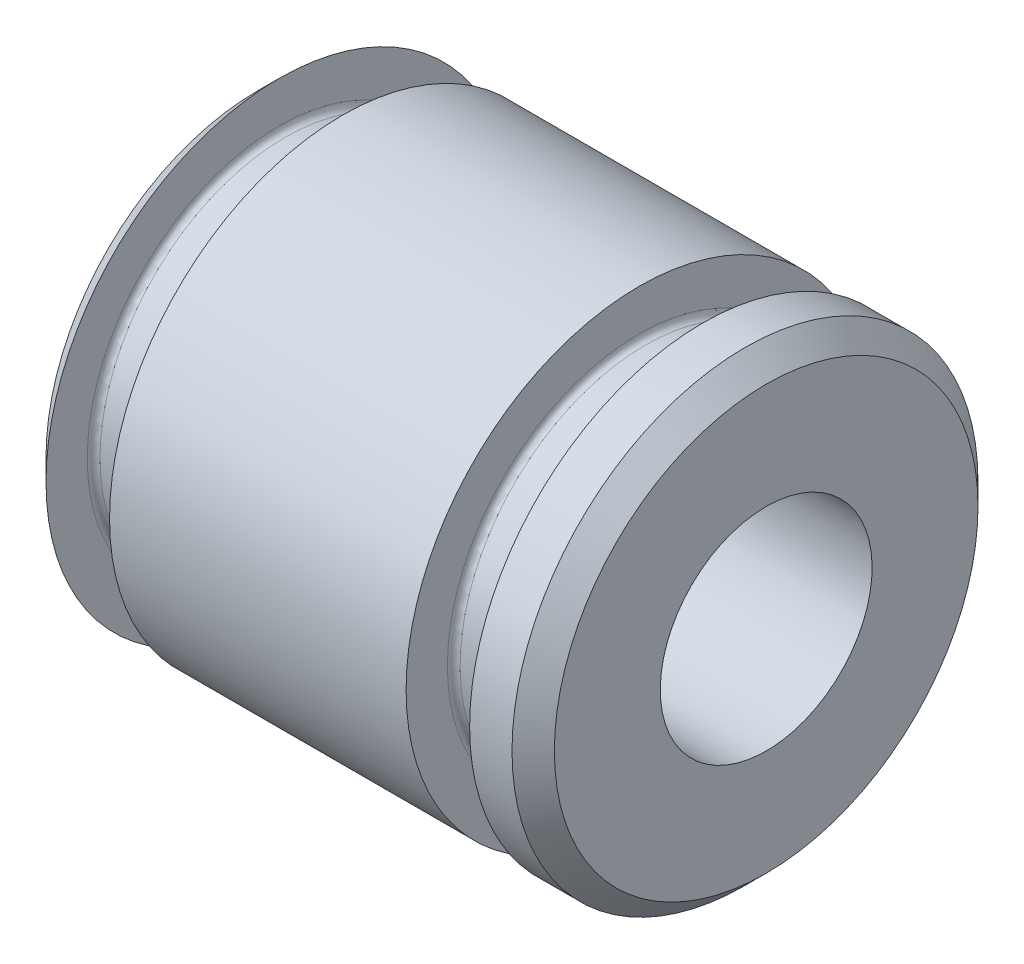
ISO-10303-21;
HEADER;
FILE_DESCRIPTION(('STEP AP214'),'2;1');
FILE_NAME('part.step','',(''),(''),'','','');
FILE_SCHEMA(('AUTOMOTIVE_DESIGN { 1 0 10303 214 1 1 1 1 }'));
ENDSEC;
DATA;
#1=APPLICATION_CONTEXT('core data for automotive mechanical design processes');
#2=APPLICATION_PROTOCOL_DEFINITION('international standard','automotive_design',2000,#1);
#3=PRODUCT_CONTEXT('',#1,'mechanical');
#4=PRODUCT('Part','Part','',(#3));
#5=PRODUCT_RELATED_PRODUCT_CATEGORY('part','',(#4));
#6=PRODUCT_DEFINITION_FORMATION('','',#4);
#7=PRODUCT_DEFINITION_CONTEXT('part definition',#1,'design');
#8=PRODUCT_DEFINITION('design','',#6,#7);
#9=PRODUCT_DEFINITION_SHAPE('','',#8);
#10=(LENGTH_UNIT() NAMED_UNIT(*) SI_UNIT(.MILLI.,.METRE.));
#11=(NAMED_UNIT(*) PLANE_ANGLE_UNIT() SI_UNIT($,.RADIAN.));
#12=(NAMED_UNIT(*) SI_UNIT($,.STERADIAN.) SOLID_ANGLE_UNIT());
#13=UNCERTAINTY_MEASURE_WITH_UNIT(LENGTH_MEASURE(1.E-05),#10,'distance_accuracy_value','');
#14=(GEOMETRIC_REPRESENTATION_CONTEXT(3) GLOBAL_UNCERTAINTY_ASSIGNED_CONTEXT((#13)) GLOBAL_UNIT_ASSIGNED_CONTEXT((#10,
#11,#12)) REPRESENTATION_CONTEXT('',''));
#15=CARTESIAN_POINT('',(0.,0.,0.));
#16=DIRECTION('',(0.,0.,1.));
#17=DIRECTION('',(1.,0.,0.));
#18=AXIS2_PLACEMENT_3D('',#15,#16,#17);
#19=CARTESIAN_POINT('',(0.,0.,0.));
#20=DIRECTION('',(-1.,0.,0.));
#21=DIRECTION('',(0.,-1.,0.));
#22=AXIS2_PLACEMENT_3D('',#19,#20,#21);
#23=PLANE('',#22);
#24=CARTESIAN_POINT('',(0.,0.,0.));
#25=DIRECTION('',(-1.,0.,0.));
#26=DIRECTION('',(0.,-1.,0.));
#27=AXIS2_PLACEMENT_3D('',#24,#25,#26);
#28=CIRCLE('',#27,9.99999999999999);
#29=CARTESIAN_POINT('',(0.,-9.99999999999999,0.));
#30=VERTEX_POINT('',#29);
#31=EDGE_CURVE('E67',#30,#30,#28,.T.);
#32=ORIENTED_EDGE('',*,*,#31,.T.);
#33=EDGE_LOOP('',(#32));
#34=FACE_BOUND('',#33,.T.);
#35=ADVANCED_FACE('F35',(#34),#23,.T.);
#36=CARTESIAN_POINT('',(1.,11.,0.));
#37=DIRECTION('',(1.,0.,0.));
#38=DIRECTION('',(0.,1.,0.));
#39=AXIS2_PLACEMENT_3D('',#36,#37,#38);
#40=PLANE('',#39);
#41=CARTESIAN_POINT('',(1.,0.,0.));
#42=DIRECTION('',(1.,0.,0.));
#43=DIRECTION('',(0.,1.,0.));
#44=AXIS2_PLACEMENT_3D('',#41,#42,#43);
#45=CIRCLE('',#44,9.05);
#46=CARTESIAN_POINT('',(1.,9.05,0.));
#47=VERTEX_POINT('',#46);
#48=EDGE_CURVE('E10',#47,#47,#45,.F.);
#49=ORIENTED_EDGE('',*,*,#48,.T.);
#50=EDGE_LOOP('',(#49));
#51=FACE_BOUND('',#50,.T.);
#52=CARTESIAN_POINT('',(1.,0.,0.));
#53=DIRECTION('',(1.,0.,0.));
#54=DIRECTION('',(0.,1.,0.));
#55=AXIS2_PLACEMENT_3D('',#52,#53,#54);
#56=CIRCLE('',#55,11.);
#57=CARTESIAN_POINT('',(0.999999999999999,11.,0.));
#58=VERTEX_POINT('',#57);
#59=EDGE_CURVE('E76',#58,#58,#56,.T.);
#60=ORIENTED_EDGE('',*,*,#59,.T.);
#61=EDGE_LOOP('',(#60));
#62=FACE_BOUND('',#61,.T.);
#63=ADVANCED_FACE('F115',(#51,#62),#40,.T.);
#64=CARTESIAN_POINT('',(24.,0.,0.));
#65=DIRECTION('',(1.,0.,0.));
#66=DIRECTION('',(0.,1.,0.));
#67=AXIS2_PLACEMENT_3D('',#64,#65,#66);
#68=CYLINDRICAL_SURFACE('',#67,8.75);
#69=CARTESIAN_POINT('',(3.7,0.,0.));
#70=DIRECTION('',(-1.,0.,0.));
#71=DIRECTION('',(0.,-1.,0.));
#72=AXIS2_PLACEMENT_3D('',#69,#70,#71);
#73=CIRCLE('',#72,8.75);
#74=CARTESIAN_POINT('',(3.7,-8.75,0.));
#75=VERTEX_POINT('',#74);
#76=EDGE_CURVE('E42',#75,#75,#73,.T.);
#77=ORIENTED_EDGE('',*,*,#76,.T.);
#78=EDGE_LOOP('',(#77));
#79=FACE_BOUND('',#78,.T.);
#80=CARTESIAN_POINT('',(1.3,0.,0.));
#81=DIRECTION('',(1.,0.,0.));
#82=DIRECTION('',(0.,1.,0.));
#83=AXIS2_PLACEMENT_3D('',#80,#81,#82);
#84=CIRCLE('',#83,8.75);
#85=CARTESIAN_POINT('',(1.3,8.75,0.));
#86=VERTEX_POINT('',#85);
#87=EDGE_CURVE('E46',#86,#86,#84,.T.);
#88=ORIENTED_EDGE('',*,*,#87,.T.);
#89=EDGE_LOOP('',(#88));
#90=FACE_BOUND('',#89,.T.);
#91=ADVANCED_FACE('F121',(#79,#90),#68,.T.);
#92=CARTESIAN_POINT('',(4.,8.75,0.));
#93=DIRECTION('',(-1.,0.,0.));
#94=DIRECTION('',(0.,-1.,0.));
#95=AXIS2_PLACEMENT_3D('',#92,#93,#94);
#96=PLANE('',#95);
#97=CARTESIAN_POINT('',(4.,0.,0.));
#98=DIRECTION('',(-1.,0.,0.));
#99=DIRECTION('',(0.,-1.,0.));
#100=AXIS2_PLACEMENT_3D('',#97,#98,#99);
#101=CIRCLE('',#100,9.05);
#102=CARTESIAN_POINT('',(4.,-9.05,0.));
#103=VERTEX_POINT('',#102);
#104=EDGE_CURVE('E50',#103,#103,#101,.F.);
#105=ORIENTED_EDGE('',*,*,#104,.T.);
#106=EDGE_LOOP('',(#105));
#107=FACE_BOUND('',#106,.T.);
#108=CARTESIAN_POINT('',(4.,0.,0.));
#109=DIRECTION('',(1.,0.,0.));
#110=DIRECTION('',(0.,1.,0.));
#111=AXIS2_PLACEMENT_3D('',#108,#109,#110);
#112=CIRCLE('',#111,11.);
#113=CARTESIAN_POINT('',(3.99999999999999,11.,0.));
#114=VERTEX_POINT('',#113);
#115=EDGE_CURVE('E79',#114,#114,#112,.T.);
#116=ORIENTED_EDGE('',*,*,#115,.F.);
#117=EDGE_LOOP('',(#116));
#118=FACE_BOUND('',#117,.T.);
#119=ADVANCED_FACE('F156',(#107,#118),#96,.T.);
#120=CARTESIAN_POINT('',(24.,0.,0.));
#121=DIRECTION('',(1.,0.,0.));
#122=DIRECTION('',(0.,1.,0.));
#123=AXIS2_PLACEMENT_3D('',#120,#121,#122);
#124=CYLINDRICAL_SURFACE('',#123,11.);
#125=ORIENTED_EDGE('',*,*,#115,.T.);
#126=EDGE_LOOP('',(#125));
#127=FACE_BOUND('',#126,.T.);
#128=CARTESIAN_POINT('',(18.,0.,0.));
#129=DIRECTION('',(1.,0.,0.));
#130=DIRECTION('',(0.,1.,0.));
#131=AXIS2_PLACEMENT_3D('',#128,#129,#130);
#132=CIRCLE('',#131,11.);
#133=CARTESIAN_POINT('',(18.,11.,0.));
#134=VERTEX_POINT('',#133);
#135=EDGE_CURVE('E82',#134,#134,#132,.T.);
#136=ORIENTED_EDGE('',*,*,#135,.F.);
#137=EDGE_LOOP('',(#136));
#138=FACE_BOUND('',#137,.T.);
#139=ADVANCED_FACE('F159',(#127,#138),#124,.T.);
#140=CARTESIAN_POINT('',(18.,11.,0.));
#141=DIRECTION('',(1.,0.,0.));
#142=DIRECTION('',(0.,1.,0.));
#143=AXIS2_PLACEMENT_3D('',#140,#141,#142);
#144=PLANE('',#143);
#145=CARTESIAN_POINT('',(18.,0.,0.));
#146=DIRECTION('',(1.,0.,0.));
#147=DIRECTION('',(0.,1.,0.));
#148=AXIS2_PLACEMENT_3D('',#145,#146,#147);
#149=CIRCLE('',#148,9.05);
#150=CARTESIAN_POINT('',(18.,9.05,0.));
#151=VERTEX_POINT('',#150);
#152=EDGE_CURVE('E55',#151,#151,#149,.F.);
#153=ORIENTED_EDGE('',*,*,#152,.T.);
#154=EDGE_LOOP('',(#153));
#155=FACE_BOUND('',#154,.T.);
#156=ORIENTED_EDGE('',*,*,#135,.T.);
#157=EDGE_LOOP('',(#156));
#158=FACE_BOUND('',#157,.T.);
#159=ADVANCED_FACE('F165',(#155,#158),#144,.T.);
#160=CARTESIAN_POINT('',(24.,0.,0.));
#161=DIRECTION('',(1.,0.,0.));
#162=DIRECTION('',(0.,1.,0.));
#163=AXIS2_PLACEMENT_3D('',#160,#161,#162);
#164=CYLINDRICAL_SURFACE('',#163,8.75);
#165=CARTESIAN_POINT('',(20.7,0.,0.));
#166=DIRECTION('',(-1.,0.,0.));
#167=DIRECTION('',(0.,-1.,0.));
#168=AXIS2_PLACEMENT_3D('',#165,#166,#167);
#169=CIRCLE('',#168,8.75);
#170=CARTESIAN_POINT('',(20.7,-8.74999999999999,0.));
#171=VERTEX_POINT('',#170);
#172=EDGE_CURVE('E58',#171,#171,#169,.T.);
#173=ORIENTED_EDGE('',*,*,#172,.T.);
#174=EDGE_LOOP('',(#173));
#175=FACE_BOUND('',#174,.T.);
#176=CARTESIAN_POINT('',(18.3,0.,0.));
#177=DIRECTION('',(1.,0.,0.));
#178=DIRECTION('',(0.,1.,0.));
#179=AXIS2_PLACEMENT_3D('',#176,#177,#178);
#180=CIRCLE('',#179,8.75);
#181=CARTESIAN_POINT('',(18.3,8.75,0.));
#182=VERTEX_POINT('',#181);
#183=EDGE_CURVE('E61',#182,#182,#180,.T.);
#184=ORIENTED_EDGE('',*,*,#183,.T.);
#185=EDGE_LOOP('',(#184));
#186=FACE_BOUND('',#185,.T.);
#187=ADVANCED_FACE('F170',(#175,#186),#164,.T.);
#188=CARTESIAN_POINT('',(21.,8.75,0.));
#189=DIRECTION('',(-1.,0.,0.));
#190=DIRECTION('',(0.,-1.,0.));
#191=AXIS2_PLACEMENT_3D('',#188,#189,#190);
#192=PLANE('',#191);
#193=CARTESIAN_POINT('',(21.,0.,0.));
#194=DIRECTION('',(-1.,0.,0.));
#195=DIRECTION('',(0.,-1.,0.));
#196=AXIS2_PLACEMENT_3D('',#193,#194,#195);
#197=CIRCLE('',#196,9.05);
#198=CARTESIAN_POINT('',(21.,-9.04999999999999,0.));
#199=VERTEX_POINT('',#198);
#200=EDGE_CURVE('E64',#199,#199,#197,.F.);
#201=ORIENTED_EDGE('',*,*,#200,.T.);
#202=EDGE_LOOP('',(#201));
#203=FACE_BOUND('',#202,.T.);
#204=CARTESIAN_POINT('',(21.,0.,0.));
#205=DIRECTION('',(1.,0.,0.));
#206=DIRECTION('',(0.,1.,0.));
#207=AXIS2_PLACEMENT_3D('',#204,#205,#206);
#208=CIRCLE('',#207,11.);
#209=CARTESIAN_POINT('',(21.,11.,0.));
#210=VERTEX_POINT('',#209);
#211=EDGE_CURVE('E85',#210,#210,#208,.T.);
#212=ORIENTED_EDGE('',*,*,#211,.F.);
#213=EDGE_LOOP('',(#212));
#214=FACE_BOUND('',#213,.T.);
#215=ADVANCED_FACE('F111',(#203,#214),#192,.T.);
#216=CARTESIAN_POINT('',(24.,0.,0.));
#217=DIRECTION('',(1.,0.,0.));
#218=DIRECTION('',(0.,1.,0.));
#219=AXIS2_PLACEMENT_3D('',#216,#217,#218);
#220=CYLINDRICAL_SURFACE('',#219,11.);
#221=CARTESIAN_POINT('',(23.,0.,0.));
#222=DIRECTION('',(1.,0.,0.));
#223=DIRECTION('',(0.,1.,0.));
#224=AXIS2_PLACEMENT_3D('',#221,#222,#223);
#225=CIRCLE('',#224,11.);
#226=CARTESIAN_POINT('',(23.,11.,0.));
#227=VERTEX_POINT('',#226);
#228=EDGE_CURVE('E70',#227,#227,#225,.F.);
#229=ORIENTED_EDGE('',*,*,#228,.T.);
#230=EDGE_LOOP('',(#229));
#231=FACE_BOUND('',#230,.T.);
#232=ORIENTED_EDGE('',*,*,#211,.T.);
#233=EDGE_LOOP('',(#232));
#234=FACE_BOUND('',#233,.T.);
#235=ADVANCED_FACE('F105',(#231,#234),#220,.T.);
#236=CARTESIAN_POINT('',(24.,11.,0.));
#237=DIRECTION('',(1.,0.,0.));
#238=DIRECTION('',(0.,1.,0.));
#239=AXIS2_PLACEMENT_3D('',#236,#237,#238);
#240=PLANE('',#239);
#241=CARTESIAN_POINT('',(24.,0.,0.));
#242=DIRECTION('',(1.,0.,0.));
#243=DIRECTION('',(0.,1.,0.));
#244=AXIS2_PLACEMENT_3D('',#241,#242,#243);
#245=CIRCLE('',#244,9.99999999999999);
#246=CARTESIAN_POINT('',(24.,9.99999999999999,0.));
#247=VERTEX_POINT('',#246);
#248=EDGE_CURVE('E73',#247,#247,#245,.T.);
#249=ORIENTED_EDGE('',*,*,#248,.T.);
#250=EDGE_LOOP('',(#249));
#251=FACE_BOUND('',#250,.T.);
#252=CARTESIAN_POINT('',(24.,0.,0.));
#253=DIRECTION('',(1.,0.,0.));
#254=DIRECTION('',(0.,1.,0.));
#255=AXIS2_PLACEMENT_3D('',#252,#253,#254);
#256=CIRCLE('',#255,5.);
#257=CARTESIAN_POINT('',(24.,5.,0.));
#258=VERTEX_POINT('',#257);
#259=EDGE_CURVE('E89',#258,#258,#256,.T.);
#260=ORIENTED_EDGE('',*,*,#259,.F.);
#261=EDGE_LOOP('',(#260));
#262=FACE_BOUND('',#261,.T.);
#263=ADVANCED_FACE('F100',(#251,#262),#240,.T.);
#264=CARTESIAN_POINT('',(3.,0.,0.));
#265=DIRECTION('',(1.,0.,0.));
#266=DIRECTION('',(0.,1.,0.));
#267=AXIS2_PLACEMENT_3D('',#264,#265,#266);
#268=CYLINDRICAL_SURFACE('',#267,5.);
#269=CARTESIAN_POINT('',(3.,0.,0.));
#270=DIRECTION('',(1.,0.,0.));
#271=DIRECTION('',(0.,1.,0.));
#272=AXIS2_PLACEMENT_3D('',#269,#270,#271);
#273=CIRCLE('',#272,5.);
#274=CARTESIAN_POINT('',(3.,5.,0.));
#275=VERTEX_POINT('',#274);
#276=EDGE_CURVE('E88',#275,#275,#273,.T.);
#277=CARTESIAN_POINT('',(3.,5.,0.));
#278=CARTESIAN_POINT('',(3.21875,5.,0.));
#279=CARTESIAN_POINT('',(3.4375,5.,0.));
#280=CARTESIAN_POINT('',(3.875,5.,0.));
#281=CARTESIAN_POINT('',(4.09375,5.,0.));
#282=CARTESIAN_POINT('',(4.53125,5.,0.));
#283=CARTESIAN_POINT('',(4.75,5.,0.));
#284=CARTESIAN_POINT('',(5.1875,5.,0.));
#285=CARTESIAN_POINT('',(5.40625,5.,0.));
#286=CARTESIAN_POINT('',(5.84375,5.,0.));
#287=CARTESIAN_POINT('',(6.0625,5.,0.));
#288=CARTESIAN_POINT('',(6.5,5.,0.));
#289=CARTESIAN_POINT('',(6.71875,5.,0.));
#290=CARTESIAN_POINT('',(7.15625,5.,0.));
#291=CARTESIAN_POINT('',(7.375,5.,0.));
#292=CARTESIAN_POINT('',(7.8125,5.,0.));
#293=CARTESIAN_POINT('',(8.03125,5.,0.));
#294=CARTESIAN_POINT('',(8.46875,5.,0.));
#295=CARTESIAN_POINT('',(8.6875,5.,0.));
#296=CARTESIAN_POINT('',(9.125,5.,0.));
#297=CARTESIAN_POINT('',(9.34375,5.,0.));
#298=CARTESIAN_POINT('',(9.78125,5.,0.));
#299=CARTESIAN_POINT('',(10.,5.,0.));
#300=CARTESIAN_POINT('',(10.4375,5.,0.));
#301=CARTESIAN_POINT('',(10.65625,5.,0.));
#302=CARTESIAN_POINT('',(11.09375,5.,0.));
#303=CARTESIAN_POINT('',(11.3125,5.,0.));
#304=CARTESIAN_POINT('',(11.75,5.,0.));
#305=CARTESIAN_POINT('',(11.96875,5.,0.));
#306=CARTESIAN_POINT('',(12.40625,5.,0.));
#307=CARTESIAN_POINT('',(12.625,5.,0.));
#308=CARTESIAN_POINT('',(13.0625,5.,0.));
#309=CARTESIAN_POINT('',(13.28125,5.,0.));
#310=CARTESIAN_POINT('',(13.71875,5.,0.));
#311=CARTESIAN_POINT('',(13.9375,5.,0.));
#312=CARTESIAN_POINT('',(14.375,5.,0.));
#313=CARTESIAN_POINT('',(14.59375,5.,0.));
#314=CARTESIAN_POINT('',(15.03125,5.,0.));
#315=CARTESIAN_POINT('',(15.25,5.,0.));
#316=CARTESIAN_POINT('',(15.6875,5.,0.));
#317=CARTESIAN_POINT('',(15.90625,5.,0.));
#318=CARTESIAN_POINT('',(16.34375,5.,0.));
#319=CARTESIAN_POINT('',(16.5625,5.,0.));
#320=CARTESIAN_POINT('',(17.,5.,0.));
#321=CARTESIAN_POINT('',(17.21875,5.,0.));
#322=CARTESIAN_POINT('',(17.65625,5.,0.));
#323=CARTESIAN_POINT('',(17.875,5.,0.));
#324=CARTESIAN_POINT('',(18.3125,5.,0.));
#325=CARTESIAN_POINT('',(18.53125,5.,0.));
#326=CARTESIAN_POINT('',(18.96875,5.,0.));
#327=CARTESIAN_POINT('',(19.1875,5.,0.));
#328=CARTESIAN_POINT('',(19.625,5.,0.));
#329=CARTESIAN_POINT('',(19.84375,5.,0.));
#330=CARTESIAN_POINT('',(20.28125,5.,0.));
#331=CARTESIAN_POINT('',(20.5,5.,0.));
#332=CARTESIAN_POINT('',(20.9375,5.,0.));
#333=CARTESIAN_POINT('',(21.15625,5.,0.));
#334=CARTESIAN_POINT('',(21.59375,5.,0.));
#335=CARTESIAN_POINT('',(21.8125,5.,0.));
#336=CARTESIAN_POINT('',(22.25,5.,0.));
#337=CARTESIAN_POINT('',(22.46875,5.,0.));
#338=CARTESIAN_POINT('',(22.90625,5.,0.));
#339=CARTESIAN_POINT('',(23.125,5.,0.));
#340=CARTESIAN_POINT('',(23.5625,5.,0.));
#341=CARTESIAN_POINT('',(23.78125,5.,0.));
#342=CARTESIAN_POINT('',(24.,5.,0.));
#343=B_SPLINE_CURVE_WITH_KNOTS('',3,(#277,#278,#279,#280,#281,#282,#283,#284,#285,#286,#287,
#288,#289,#290,#291,#292,#293,#294,#295,#296,#297,#298,#299,#300,#301,#302,#303,#304,#305,#306,
#307,#308,#309,#310,#311,#312,#313,#314,#315,#316,#317,#318,#319,#320,#321,#322,#323,#324,#325,
#326,#327,#328,#329,#330,#331,#332,#333,#334,#335,#336,#337,#338,#339,#340,#341,#342),
.UNSPECIFIED.,.F.,.F.,(4,2,2,2,2,2,2,2,2,2,2,2,2,2,2,2,2,2,2,2,2,2,2,2,2,2,2,2,2,2,2,2,4),(0.,
0.65625,1.3125,1.96875,2.625,3.28125,3.9375,4.59375,5.25,5.90625,6.5625,7.21875,7.875,8.53125,
9.1875,9.84375,10.5,11.15625,11.8125,12.46875,13.125,13.78125,14.4375,15.09375,15.75,16.40625,
17.0625,17.71875,18.375,19.03125,19.6875,20.34375,21.),.UNSPECIFIED.);
#344=EDGE_CURVE('BSEAM97',#275,#258,#343,.T.);
#345=ORIENTED_EDGE('',*,*,#276,.F.);
#346=ORIENTED_EDGE('',*,*,#259,.T.);
#347=ORIENTED_EDGE('',*,*,#344,.T.);
#348=ORIENTED_EDGE('',*,*,#344,.F.);
#349=EDGE_LOOP('',(#345,#347,#346,#348));
#350=FACE_BOUND('',#349,.T.);
#351=ADVANCED_FACE('F97',(#350),#268,.F.);
#352=CARTESIAN_POINT('',(3.,0.,0.));
#353=DIRECTION('',(1.,0.,0.));
#354=DIRECTION('',(0.,1.,0.));
#355=AXIS2_PLACEMENT_3D('',#352,#353,#354);
#356=PLANE('',#355);
#357=ORIENTED_EDGE('',*,*,#276,.T.);
#358=EDGE_LOOP('',(#357));
#359=FACE_BOUND('',#358,.T.);
#360=ADVANCED_FACE('F95',(#359),#356,.T.);
#361=CARTESIAN_POINT('',(24.,0.,0.));
#362=DIRECTION('',(-1.,0.,0.));
#363=DIRECTION('',(0.,-1.,0.));
#364=AXIS2_PLACEMENT_3D('',#361,#362,#363);
#365=CONICAL_SURFACE('',#364,9.99999999999999,0.785398163397448);
#366=ORIENTED_EDGE('',*,*,#228,.F.);
#367=EDGE_LOOP('',(#366));
#368=FACE_BOUND('',#367,.T.);
#369=ORIENTED_EDGE('',*,*,#248,.F.);
#370=EDGE_LOOP('',(#369));
#371=FACE_BOUND('',#370,.T.);
#372=ADVANCED_FACE('F126',(#368,#371),#365,.T.);
#373=CARTESIAN_POINT('',(1.00000000000001,0.,0.));
#374=DIRECTION('',(1.,0.,0.));
#375=DIRECTION('',(0.,1.,0.));
#376=AXIS2_PLACEMENT_3D('',#373,#374,#375);
#377=CONICAL_SURFACE('',#376,11.,0.785398163397449);
#378=ORIENTED_EDGE('',*,*,#31,.F.);
#379=EDGE_LOOP('',(#378));
#380=FACE_BOUND('',#379,.T.);
#381=ORIENTED_EDGE('',*,*,#59,.F.);
#382=EDGE_LOOP('',(#381));
#383=FACE_BOUND('',#382,.T.);
#384=ADVANCED_FACE('F132',(#380,#383),#377,.T.);
#385=CARTESIAN_POINT('',(20.7,0.,0.));
#386=DIRECTION('',(-1.,0.,0.));
#387=DIRECTION('',(0.,-1.,0.));
#388=AXIS2_PLACEMENT_3D('',#385,#386,#387);
#389=TOROIDAL_SURFACE('',#388,9.05,0.3);
#390=ORIENTED_EDGE('',*,*,#172,.F.);
#391=EDGE_LOOP('',(#390));
#392=FACE_BOUND('',#391,.T.);
#393=ORIENTED_EDGE('',*,*,#200,.F.);
#394=EDGE_LOOP('',(#393));
#395=FACE_BOUND('',#394,.T.);
#396=ADVANCED_FACE('F138',(#392,#395),#389,.F.);
#397=CARTESIAN_POINT('',(18.3,0.,0.));
#398=DIRECTION('',(1.,0.,0.));
#399=DIRECTION('',(0.,1.,0.));
#400=AXIS2_PLACEMENT_3D('',#397,#398,#399);
#401=TOROIDAL_SURFACE('',#400,9.05,0.3);
#402=ORIENTED_EDGE('',*,*,#152,.F.);
#403=EDGE_LOOP('',(#402));
#404=FACE_BOUND('',#403,.T.);
#405=ORIENTED_EDGE('',*,*,#183,.F.);
#406=EDGE_LOOP('',(#405));
#407=FACE_BOUND('',#406,.T.);
#408=ADVANCED_FACE('F142',(#404,#407),#401,.F.);
#409=CARTESIAN_POINT('',(3.7,0.,0.));
#410=DIRECTION('',(-1.,0.,0.));
#411=DIRECTION('',(0.,-1.,0.));
#412=AXIS2_PLACEMENT_3D('',#409,#410,#411);
#413=TOROIDAL_SURFACE('',#412,9.05,0.3);
#414=ORIENTED_EDGE('',*,*,#76,.F.);
#415=EDGE_LOOP('',(#414));
#416=FACE_BOUND('',#415,.T.);
#417=ORIENTED_EDGE('',*,*,#104,.F.);
#418=EDGE_LOOP('',(#417));
#419=FACE_BOUND('',#418,.T.);
#420=ADVANCED_FACE('F145',(#416,#419),#413,.F.);
#421=CARTESIAN_POINT('',(1.3,0.,0.));
#422=DIRECTION('',(1.,0.,0.));
#423=DIRECTION('',(0.,1.,0.));
#424=AXIS2_PLACEMENT_3D('',#421,#422,#423);
#425=TOROIDAL_SURFACE('',#424,9.05,0.3);
#426=ORIENTED_EDGE('',*,*,#48,.F.);
#427=EDGE_LOOP('',(#426));
#428=FACE_BOUND('',#427,.T.);
#429=ORIENTED_EDGE('',*,*,#87,.F.);
#430=EDGE_LOOP('',(#429));
#431=FACE_BOUND('',#430,.T.);
#432=ADVANCED_FACE('F37',(#428,#431),#425,.F.);
#433=CLOSED_SHELL('',(#35,#63,#91,#119,#139,#159,#187,#215,#235,#263,#351,#360,#372,#384,#396,
#408,#420,#432));
#434=MANIFOLD_SOLID_BREP('B2',#433);
#435=ADVANCED_BREP_SHAPE_REPRESENTATION('',(#18,#434),#14);
#436=SHAPE_DEFINITION_REPRESENTATION(#9,#435);
ENDSEC;
END-ISO-10303-21;
